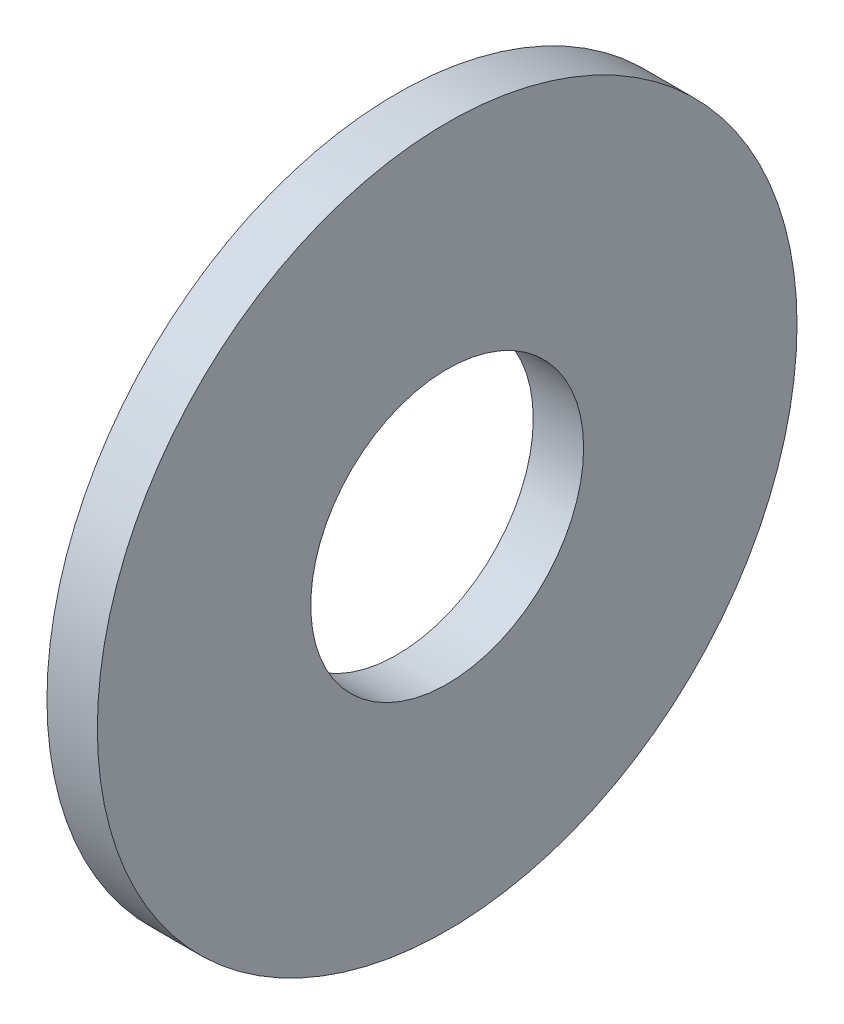
ISO-10303-21;
HEADER;
FILE_DESCRIPTION(('STEP AP214'),'2;1');
FILE_NAME('part.step','',(''),(''),'','','');
FILE_SCHEMA(('AUTOMOTIVE_DESIGN { 1 0 10303 214 1 1 1 1 }'));
ENDSEC;
DATA;
#1=APPLICATION_CONTEXT('core data for automotive mechanical design processes');
#2=APPLICATION_PROTOCOL_DEFINITION('international standard','automotive_design',2000,#1);
#3=PRODUCT_CONTEXT('',#1,'mechanical');
#4=PRODUCT('Part','Part','',(#3));
#5=PRODUCT_RELATED_PRODUCT_CATEGORY('part','',(#4));
#6=PRODUCT_DEFINITION_FORMATION('','',#4);
#7=PRODUCT_DEFINITION_CONTEXT('part definition',#1,'design');
#8=PRODUCT_DEFINITION('design','',#6,#7);
#9=PRODUCT_DEFINITION_SHAPE('','',#8);
#10=(LENGTH_UNIT() NAMED_UNIT(*) SI_UNIT(.MILLI.,.METRE.));
#11=(NAMED_UNIT(*) PLANE_ANGLE_UNIT() SI_UNIT($,.RADIAN.));
#12=(NAMED_UNIT(*) SI_UNIT($,.STERADIAN.) SOLID_ANGLE_UNIT());
#13=UNCERTAINTY_MEASURE_WITH_UNIT(LENGTH_MEASURE(1.E-05),#10,'distance_accuracy_value','');
#14=(GEOMETRIC_REPRESENTATION_CONTEXT(3) GLOBAL_UNCERTAINTY_ASSIGNED_CONTEXT((#13)) GLOBAL_UNIT_ASSIGNED_CONTEXT((#10,
#11,#12)) REPRESENTATION_CONTEXT('',''));
#15=CARTESIAN_POINT('',(0.,0.,0.));
#16=DIRECTION('',(0.,0.,1.));
#17=DIRECTION('',(1.,0.,0.));
#18=AXIS2_PLACEMENT_3D('',#15,#16,#17);
#19=CARTESIAN_POINT('',(0.9144,0.,0.));
#20=DIRECTION('',(1.,0.,0.));
#21=DIRECTION('',(0.,0.,-1.));
#22=AXIS2_PLACEMENT_3D('',#19,#20,#21);
#23=PLANE('',#22);
#24=CARTESIAN_POINT('',(0.9144,0.,0.));
#25=DIRECTION('',(1.,0.,0.));
#26=DIRECTION('',(0.,0.,-1.));
#27=AXIS2_PLACEMENT_3D('',#24,#25,#26);
#28=CIRCLE('',#27,12.7);
#29=CARTESIAN_POINT('',(0.9144,0.,-12.7));
#30=VERTEX_POINT('',#29);
#31=EDGE_CURVE('E10',#30,#30,#28,.T.);
#32=ORIENTED_EDGE('',*,*,#31,.T.);
#33=EDGE_LOOP('',(#32));
#34=FACE_BOUND('',#33,.T.);
#35=CARTESIAN_POINT('',(0.9144,0.,0.));
#36=DIRECTION('',(1.,0.,0.));
#37=DIRECTION('',(0.,0.,-1.));
#38=AXIS2_PLACEMENT_3D('',#35,#36,#37);
#39=CIRCLE('',#38,4.953);
#40=CARTESIAN_POINT('',(0.9144,0.,-4.953));
#41=VERTEX_POINT('',#40);
#42=EDGE_CURVE('E50',#41,#41,#39,.T.);
#43=ORIENTED_EDGE('',*,*,#42,.F.);
#44=EDGE_LOOP('',(#43));
#45=FACE_BOUND('',#44,.T.);
#46=ADVANCED_FACE('F39',(#34,#45),#23,.T.);
#47=CARTESIAN_POINT('',(-0.9144,0.,0.));
#48=DIRECTION('',(1.,0.,0.));
#49=DIRECTION('',(0.,0.,-1.));
#50=AXIS2_PLACEMENT_3D('',#47,#48,#49);
#51=PLANE('',#50);
#52=CARTESIAN_POINT('',(-0.9144,0.,0.));
#53=DIRECTION('',(1.,0.,0.));
#54=DIRECTION('',(0.,0.,-1.));
#55=AXIS2_PLACEMENT_3D('',#52,#53,#54);
#56=CIRCLE('',#55,12.7);
#57=CARTESIAN_POINT('',(-0.9144,0.,-12.7));
#58=VERTEX_POINT('',#57);
#59=EDGE_CURVE('E43',#58,#58,#56,.T.);
#60=ORIENTED_EDGE('',*,*,#59,.F.);
#61=EDGE_LOOP('',(#60));
#62=FACE_BOUND('',#61,.T.);
#63=CARTESIAN_POINT('',(-0.9144,0.,0.));
#64=DIRECTION('',(1.,0.,0.));
#65=DIRECTION('',(0.,0.,-1.));
#66=AXIS2_PLACEMENT_3D('',#63,#64,#65);
#67=CIRCLE('',#66,4.953);
#68=CARTESIAN_POINT('',(-0.9144,0.,-4.953));
#69=VERTEX_POINT('',#68);
#70=EDGE_CURVE('E52',#69,#69,#67,.T.);
#71=ORIENTED_EDGE('',*,*,#70,.T.);
#72=EDGE_LOOP('',(#71));
#73=FACE_BOUND('',#72,.T.);
#74=ADVANCED_FACE('F62',(#62,#73),#51,.F.);
#75=CARTESIAN_POINT('',(0.9144,0.,0.));
#76=DIRECTION('',(-1.,0.,0.));
#77=DIRECTION('',(0.,0.,1.));
#78=AXIS2_PLACEMENT_3D('',#75,#76,#77);
#79=CYLINDRICAL_SURFACE('',#78,12.7);
#80=ORIENTED_EDGE('',*,*,#31,.F.);
#81=EDGE_LOOP('',(#80));
#82=FACE_BOUND('',#81,.T.);
#83=ORIENTED_EDGE('',*,*,#59,.T.);
#84=EDGE_LOOP('',(#83));
#85=FACE_BOUND('',#84,.T.);
#86=ADVANCED_FACE('F41',(#82,#85),#79,.T.);
#87=CARTESIAN_POINT('',(0.9144,0.,0.));
#88=DIRECTION('',(-1.,0.,0.));
#89=DIRECTION('',(0.,0.,1.));
#90=AXIS2_PLACEMENT_3D('',#87,#88,#89);
#91=CYLINDRICAL_SURFACE('',#90,4.953);
#92=ORIENTED_EDGE('',*,*,#42,.T.);
#93=EDGE_LOOP('',(#92));
#94=FACE_BOUND('',#93,.T.);
#95=ORIENTED_EDGE('',*,*,#70,.F.);
#96=EDGE_LOOP('',(#95));
#97=FACE_BOUND('',#96,.T.);
#98=ADVANCED_FACE('F58',(#94,#97),#91,.F.);
#99=CLOSED_SHELL('',(#46,#74,#86,#98));
#100=MANIFOLD_SOLID_BREP('B2',#99);
#101=ADVANCED_BREP_SHAPE_REPRESENTATION('',(#18,#100),#14);
#102=SHAPE_DEFINITION_REPRESENTATION(#9,#101);
ENDSEC;
END-ISO-10303-21;
